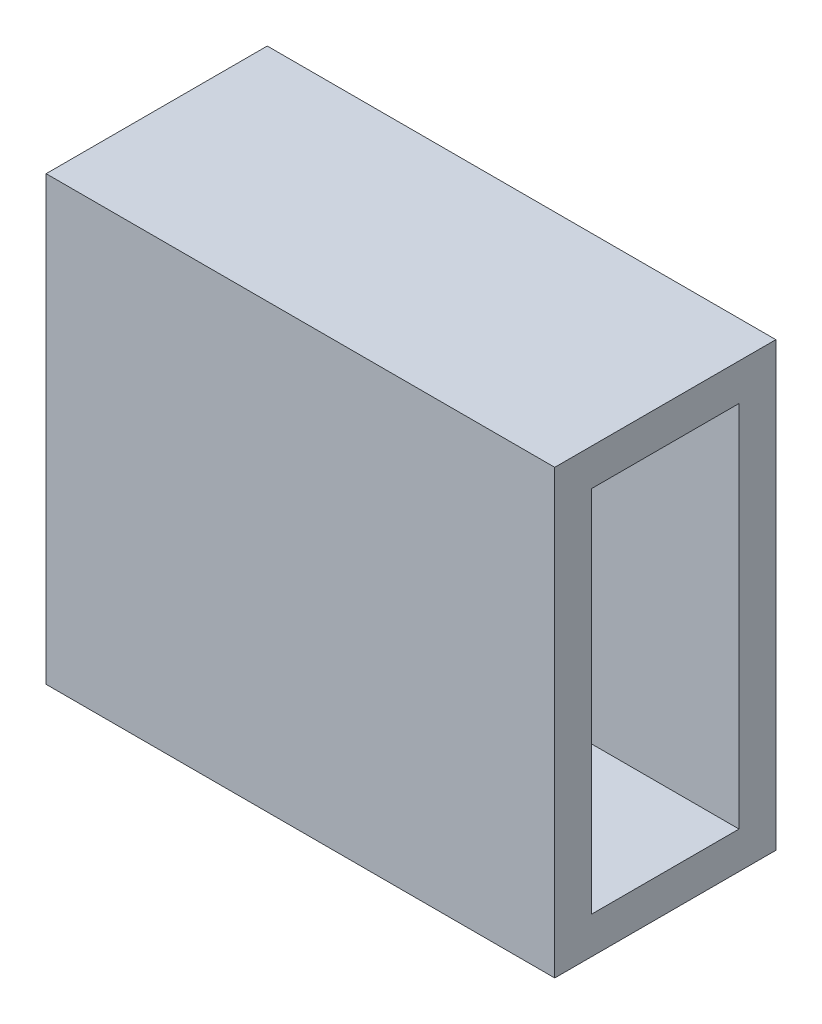
ISO-10303-21;
HEADER;
FILE_DESCRIPTION(('STEP AP214'),'2;1');
FILE_NAME('part.step','',(''),(''),'','','');
FILE_SCHEMA(('AUTOMOTIVE_DESIGN { 1 0 10303 214 1 1 1 1 }'));
ENDSEC;
DATA;
#1=APPLICATION_CONTEXT('core data for automotive mechanical design processes');
#2=APPLICATION_PROTOCOL_DEFINITION('international standard','automotive_design',2000,#1);
#3=PRODUCT_CONTEXT('',#1,'mechanical');
#4=PRODUCT('Part','Part','',(#3));
#5=PRODUCT_RELATED_PRODUCT_CATEGORY('part','',(#4));
#6=PRODUCT_DEFINITION_FORMATION('','',#4);
#7=PRODUCT_DEFINITION_CONTEXT('part definition',#1,'design');
#8=PRODUCT_DEFINITION('design','',#6,#7);
#9=PRODUCT_DEFINITION_SHAPE('','',#8);
#10=(LENGTH_UNIT() NAMED_UNIT(*) SI_UNIT(.MILLI.,.METRE.));
#11=(NAMED_UNIT(*) PLANE_ANGLE_UNIT() SI_UNIT($,.RADIAN.));
#12=(NAMED_UNIT(*) SI_UNIT($,.STERADIAN.) SOLID_ANGLE_UNIT());
#13=UNCERTAINTY_MEASURE_WITH_UNIT(LENGTH_MEASURE(1.E-05),#10,'distance_accuracy_value','');
#14=(GEOMETRIC_REPRESENTATION_CONTEXT(3) GLOBAL_UNCERTAINTY_ASSIGNED_CONTEXT((#13)) GLOBAL_UNIT_ASSIGNED_CONTEXT((#10,
#11,#12)) REPRESENTATION_CONTEXT('',''));
#15=CARTESIAN_POINT('',(0.,0.,0.));
#16=DIRECTION('',(0.,0.,1.));
#17=DIRECTION('',(1.,0.,0.));
#18=AXIS2_PLACEMENT_3D('',#15,#16,#17);
#19=CARTESIAN_POINT('',(21.694189942742,38.1,25.4));
#20=DIRECTION('',(0.,1.,0.));
#21=DIRECTION('',(0.,0.,1.));
#22=AXIS2_PLACEMENT_3D('',#19,#20,#21);
#23=PLANE('',#22);
#24=DIRECTION('',(-1.,0.,0.));
#25=VECTOR('',#24,1.);
#26=CARTESIAN_POINT('',(21.694189942742,38.1,25.4));
#27=LINE('',#26,#25);
#28=CARTESIAN_POINT('',(-64.77,38.1,25.4));
#29=VERTEX_POINT('',#28);
#30=CARTESIAN_POINT('',(-152.4,38.1,25.4));
#31=VERTEX_POINT('',#30);
#32=EDGE_CURVE('E127',#29,#31,#27,.T.);
#33=ORIENTED_EDGE('',*,*,#32,.F.);
#34=DIRECTION('',(0.,0.,-1.));
#35=VECTOR('',#34,1.);
#36=CARTESIAN_POINT('',(-64.77,38.1,25.4));
#37=LINE('',#36,#35);
#38=CARTESIAN_POINT('',(-64.77,38.1,-12.7));
#39=VERTEX_POINT('',#38);
#40=EDGE_CURVE('E121',#29,#39,#37,.T.);
#41=ORIENTED_EDGE('',*,*,#40,.T.);
#42=DIRECTION('',(-1.,0.,0.));
#43=VECTOR('',#42,1.);
#44=CARTESIAN_POINT('',(21.694189942742,38.1,-12.7));
#45=LINE('',#44,#43);
#46=CARTESIAN_POINT('',(-152.4,38.1,-12.7));
#47=VERTEX_POINT('',#46);
#48=EDGE_CURVE('E123',#39,#47,#45,.T.);
#49=ORIENTED_EDGE('',*,*,#48,.T.);
#50=DIRECTION('',(0.,0.,-1.));
#51=VECTOR('',#50,1.);
#52=CARTESIAN_POINT('',(-152.4,38.1,25.4));
#53=LINE('',#52,#51);
#54=EDGE_CURVE('E149',#31,#47,#53,.T.);
#55=ORIENTED_EDGE('',*,*,#54,.F.);
#56=EDGE_LOOP('',(#33,#41,#49,#55));
#57=FACE_BOUND('',#56,.T.);
#58=ADVANCED_FACE('F33',(#57),#23,.T.);
#59=CARTESIAN_POINT('',(21.694189942742,-38.1,25.4));
#60=DIRECTION('',(0.,0.,1.));
#61=DIRECTION('',(1.,0.,0.));
#62=AXIS2_PLACEMENT_3D('',#59,#60,#61);
#63=PLANE('',#62);
#64=DIRECTION('',(-1.,0.,0.));
#65=VECTOR('',#64,1.);
#66=CARTESIAN_POINT('',(21.694189942742,-38.1,25.4));
#67=LINE('',#66,#65);
#68=CARTESIAN_POINT('',(-64.77,-38.1,25.4));
#69=VERTEX_POINT('',#68);
#70=CARTESIAN_POINT('',(-152.4,-38.1,25.4));
#71=VERTEX_POINT('',#70);
#72=EDGE_CURVE('E130',#69,#71,#67,.T.);
#73=ORIENTED_EDGE('',*,*,#72,.F.);
#74=DIRECTION('',(0.,1.,0.));
#75=VECTOR('',#74,1.);
#76=CARTESIAN_POINT('',(-64.77,-38.1,25.4));
#77=LINE('',#76,#75);
#78=EDGE_CURVE('E124',#69,#29,#77,.T.);
#79=ORIENTED_EDGE('',*,*,#78,.T.);
#80=ORIENTED_EDGE('',*,*,#32,.T.);
#81=DIRECTION('',(0.,1.,0.));
#82=VECTOR('',#81,1.);
#83=CARTESIAN_POINT('',(-152.4,-38.1,25.4));
#84=LINE('',#83,#82);
#85=EDGE_CURVE('E116',#71,#31,#84,.T.);
#86=ORIENTED_EDGE('',*,*,#85,.F.);
#87=EDGE_LOOP('',(#73,#79,#80,#86));
#88=FACE_BOUND('',#87,.T.);
#89=ADVANCED_FACE('F169',(#88),#63,.T.);
#90=CARTESIAN_POINT('',(21.694189942742,-38.1,-12.7));
#91=DIRECTION('',(0.,-1.,0.));
#92=DIRECTION('',(0.,0.,-1.));
#93=AXIS2_PLACEMENT_3D('',#90,#91,#92);
#94=PLANE('',#93);
#95=DIRECTION('',(-1.,0.,0.));
#96=VECTOR('',#95,1.);
#97=CARTESIAN_POINT('',(21.694189942742,-38.1,-12.7));
#98=LINE('',#97,#96);
#99=CARTESIAN_POINT('',(-64.77,-38.1,-12.7));
#100=VERTEX_POINT('',#99);
#101=CARTESIAN_POINT('',(-152.4,-38.1,-12.7));
#102=VERTEX_POINT('',#101);
#103=EDGE_CURVE('E134',#100,#102,#98,.T.);
#104=ORIENTED_EDGE('',*,*,#103,.F.);
#105=DIRECTION('',(0.,0.,1.));
#106=VECTOR('',#105,1.);
#107=CARTESIAN_POINT('',(-64.77,-38.1,-12.7));
#108=LINE('',#107,#106);
#109=EDGE_CURVE('E128',#100,#69,#108,.T.);
#110=ORIENTED_EDGE('',*,*,#109,.T.);
#111=ORIENTED_EDGE('',*,*,#72,.T.);
#112=DIRECTION('',(0.,0.,1.));
#113=VECTOR('',#112,1.);
#114=CARTESIAN_POINT('',(-152.4,-38.1,-12.7));
#115=LINE('',#114,#113);
#116=EDGE_CURVE('E159',#102,#71,#115,.T.);
#117=ORIENTED_EDGE('',*,*,#116,.F.);
#118=EDGE_LOOP('',(#104,#110,#111,#117));
#119=FACE_BOUND('',#118,.T.);
#120=ADVANCED_FACE('F177',(#119),#94,.T.);
#121=CARTESIAN_POINT('',(21.694189942742,38.1,-12.7));
#122=DIRECTION('',(0.,0.,-1.));
#123=DIRECTION('',(-1.,0.,0.));
#124=AXIS2_PLACEMENT_3D('',#121,#122,#123);
#125=PLANE('',#124);
#126=ORIENTED_EDGE('',*,*,#48,.F.);
#127=DIRECTION('',(0.,-1.,0.));
#128=VECTOR('',#127,1.);
#129=CARTESIAN_POINT('',(-64.77,38.1,-12.7));
#130=LINE('',#129,#128);
#131=EDGE_CURVE('E51',#39,#100,#130,.T.);
#132=ORIENTED_EDGE('',*,*,#131,.T.);
#133=ORIENTED_EDGE('',*,*,#103,.T.);
#134=DIRECTION('',(0.,-1.,0.));
#135=VECTOR('',#134,1.);
#136=CARTESIAN_POINT('',(-152.4,38.1,-12.7));
#137=LINE('',#136,#135);
#138=EDGE_CURVE('E154',#47,#102,#137,.T.);
#139=ORIENTED_EDGE('',*,*,#138,.F.);
#140=EDGE_LOOP('',(#126,#132,#133,#139));
#141=FACE_BOUND('',#140,.T.);
#142=ADVANCED_FACE('F174',(#141),#125,.T.);
#143=CARTESIAN_POINT('',(21.694189942742,-31.75,19.05));
#144=DIRECTION('',(0.,0.,1.));
#145=DIRECTION('',(1.,0.,0.));
#146=AXIS2_PLACEMENT_3D('',#143,#144,#145);
#147=PLANE('',#146);
#148=DIRECTION('',(0.,1.,0.));
#149=VECTOR('',#148,1.);
#150=CARTESIAN_POINT('',(-64.77,-31.75,19.05));
#151=LINE('',#150,#149);
#152=CARTESIAN_POINT('',(-64.77,-31.75,19.05));
#153=VERTEX_POINT('',#152);
#154=CARTESIAN_POINT('',(-64.77,31.75,19.05));
#155=VERTEX_POINT('',#154);
#156=EDGE_CURVE('E97',#153,#155,#151,.T.);
#157=ORIENTED_EDGE('',*,*,#156,.F.);
#158=DIRECTION('',(-1.,0.,0.));
#159=VECTOR('',#158,1.);
#160=CARTESIAN_POINT('',(21.694189942742,-31.75,19.05));
#161=LINE('',#160,#159);
#162=CARTESIAN_POINT('',(-152.4,-31.75,19.05));
#163=VERTEX_POINT('',#162);
#164=EDGE_CURVE('E136',#153,#163,#161,.T.);
#165=ORIENTED_EDGE('',*,*,#164,.T.);
#166=DIRECTION('',(0.,1.,0.));
#167=VECTOR('',#166,1.);
#168=CARTESIAN_POINT('',(-152.4,-31.75,19.05));
#169=LINE('',#168,#167);
#170=CARTESIAN_POINT('',(-152.4,31.75,19.05));
#171=VERTEX_POINT('',#170);
#172=EDGE_CURVE('E100',#163,#171,#169,.T.);
#173=ORIENTED_EDGE('',*,*,#172,.T.);
#174=DIRECTION('',(-1.,0.,0.));
#175=VECTOR('',#174,1.);
#176=CARTESIAN_POINT('',(21.694189942742,31.75,19.05));
#177=LINE('',#176,#175);
#178=EDGE_CURVE('E37',#155,#171,#177,.T.);
#179=ORIENTED_EDGE('',*,*,#178,.F.);
#180=EDGE_LOOP('',(#157,#165,#173,#179));
#181=FACE_BOUND('',#180,.T.);
#182=ADVANCED_FACE('F95',(#181),#147,.F.);
#183=CARTESIAN_POINT('',(21.694189942742,-31.75,-6.35));
#184=DIRECTION('',(0.,-1.,0.));
#185=DIRECTION('',(0.,0.,-1.));
#186=AXIS2_PLACEMENT_3D('',#183,#184,#185);
#187=PLANE('',#186);
#188=DIRECTION('',(0.,0.,1.));
#189=VECTOR('',#188,1.);
#190=CARTESIAN_POINT('',(-64.77,-31.75,-6.35));
#191=LINE('',#190,#189);
#192=CARTESIAN_POINT('',(-64.77,-31.75,-6.35));
#193=VERTEX_POINT('',#192);
#194=EDGE_CURVE('E114',#193,#153,#191,.T.);
#195=ORIENTED_EDGE('',*,*,#194,.F.);
#196=DIRECTION('',(-1.,0.,0.));
#197=VECTOR('',#196,1.);
#198=CARTESIAN_POINT('',(21.694189942742,-31.75,-6.35));
#199=LINE('',#198,#197);
#200=CARTESIAN_POINT('',(-152.4,-31.75,-6.35));
#201=VERTEX_POINT('',#200);
#202=EDGE_CURVE('E139',#193,#201,#199,.T.);
#203=ORIENTED_EDGE('',*,*,#202,.T.);
#204=DIRECTION('',(0.,0.,1.));
#205=VECTOR('',#204,1.);
#206=CARTESIAN_POINT('',(-152.4,-31.75,-6.35));
#207=LINE('',#206,#205);
#208=EDGE_CURVE('E140',#201,#163,#207,.T.);
#209=ORIENTED_EDGE('',*,*,#208,.T.);
#210=ORIENTED_EDGE('',*,*,#164,.F.);
#211=EDGE_LOOP('',(#195,#203,#209,#210));
#212=FACE_BOUND('',#211,.T.);
#213=ADVANCED_FACE('F197',(#212),#187,.F.);
#214=CARTESIAN_POINT('',(21.694189942742,31.75,-6.35));
#215=DIRECTION('',(0.,0.,-1.));
#216=DIRECTION('',(-1.,0.,0.));
#217=AXIS2_PLACEMENT_3D('',#214,#215,#216);
#218=PLANE('',#217);
#219=DIRECTION('',(0.,-1.,0.));
#220=VECTOR('',#219,1.);
#221=CARTESIAN_POINT('',(-64.77,31.75,-6.35));
#222=LINE('',#221,#220);
#223=CARTESIAN_POINT('',(-64.77,31.75,-6.34999999999999));
#224=VERTEX_POINT('',#223);
#225=EDGE_CURVE('E12',#224,#193,#222,.T.);
#226=ORIENTED_EDGE('',*,*,#225,.F.);
#227=DIRECTION('',(-1.,0.,0.));
#228=VECTOR('',#227,1.);
#229=CARTESIAN_POINT('',(21.694189942742,31.75,-6.35));
#230=LINE('',#229,#228);
#231=CARTESIAN_POINT('',(-152.4,31.75,-6.35));
#232=VERTEX_POINT('',#231);
#233=EDGE_CURVE('E109',#224,#232,#230,.T.);
#234=ORIENTED_EDGE('',*,*,#233,.T.);
#235=DIRECTION('',(0.,-1.,0.));
#236=VECTOR('',#235,1.);
#237=CARTESIAN_POINT('',(-152.4,31.75,-6.35));
#238=LINE('',#237,#236);
#239=EDGE_CURVE('E105',#232,#201,#238,.T.);
#240=ORIENTED_EDGE('',*,*,#239,.T.);
#241=ORIENTED_EDGE('',*,*,#202,.F.);
#242=EDGE_LOOP('',(#226,#234,#240,#241));
#243=FACE_BOUND('',#242,.T.);
#244=ADVANCED_FACE('F194',(#243),#218,.F.);
#245=CARTESIAN_POINT('',(21.694189942742,31.75,19.05));
#246=DIRECTION('',(0.,1.,0.));
#247=DIRECTION('',(0.,0.,1.));
#248=AXIS2_PLACEMENT_3D('',#245,#246,#247);
#249=PLANE('',#248);
#250=DIRECTION('',(0.,0.,-1.));
#251=VECTOR('',#250,1.);
#252=CARTESIAN_POINT('',(-64.77,31.75,19.05));
#253=LINE('',#252,#251);
#254=EDGE_CURVE('E43',#155,#224,#253,.T.);
#255=ORIENTED_EDGE('',*,*,#254,.F.);
#256=ORIENTED_EDGE('',*,*,#178,.T.);
#257=DIRECTION('',(0.,0.,-1.));
#258=VECTOR('',#257,1.);
#259=CARTESIAN_POINT('',(-152.4,31.75,19.05));
#260=LINE('',#259,#258);
#261=EDGE_CURVE('E104',#171,#232,#260,.T.);
#262=ORIENTED_EDGE('',*,*,#261,.T.);
#263=ORIENTED_EDGE('',*,*,#233,.F.);
#264=EDGE_LOOP('',(#255,#256,#262,#263));
#265=FACE_BOUND('',#264,.T.);
#266=ADVANCED_FACE('F108',(#265),#249,.F.);
#267=CARTESIAN_POINT('',(-152.4,0.,0.));
#268=DIRECTION('',(-1.,0.,0.));
#269=DIRECTION('',(0.,0.,1.));
#270=AXIS2_PLACEMENT_3D('',#267,#268,#269);
#271=PLANE('',#270);
#272=ORIENTED_EDGE('',*,*,#172,.F.);
#273=ORIENTED_EDGE('',*,*,#208,.F.);
#274=ORIENTED_EDGE('',*,*,#239,.F.);
#275=ORIENTED_EDGE('',*,*,#261,.F.);
#276=EDGE_LOOP('',(#272,#273,#274,#275));
#277=FACE_BOUND('',#276,.T.);
#278=ORIENTED_EDGE('',*,*,#54,.T.);
#279=ORIENTED_EDGE('',*,*,#138,.T.);
#280=ORIENTED_EDGE('',*,*,#116,.T.);
#281=ORIENTED_EDGE('',*,*,#85,.T.);
#282=EDGE_LOOP('',(#278,#279,#280,#281));
#283=FACE_BOUND('',#282,.T.);
#284=ADVANCED_FACE('F165',(#277,#283),#271,.T.);
#285=CARTESIAN_POINT('',(-64.77,38.1,-12.7));
#286=DIRECTION('',(1.,0.,0.));
#287=DIRECTION('',(0.,0.,-1.));
#288=AXIS2_PLACEMENT_3D('',#285,#286,#287);
#289=PLANE('',#288);
#290=ORIENTED_EDGE('',*,*,#40,.F.);
#291=ORIENTED_EDGE('',*,*,#78,.F.);
#292=ORIENTED_EDGE('',*,*,#109,.F.);
#293=ORIENTED_EDGE('',*,*,#131,.F.);
#294=EDGE_LOOP('',(#290,#291,#292,#293));
#295=FACE_BOUND('',#294,.T.);
#296=ORIENTED_EDGE('',*,*,#194,.T.);
#297=ORIENTED_EDGE('',*,*,#156,.T.);
#298=ORIENTED_EDGE('',*,*,#254,.T.);
#299=ORIENTED_EDGE('',*,*,#225,.T.);
#300=EDGE_LOOP('',(#296,#297,#298,#299));
#301=FACE_BOUND('',#300,.T.);
#302=ADVANCED_FACE('F35',(#295,#301),#289,.T.);
#303=CLOSED_SHELL('',(#58,#89,#120,#142,#182,#213,#244,#266,#284,#302));
#304=MANIFOLD_SOLID_BREP('B2',#303);
#305=ADVANCED_BREP_SHAPE_REPRESENTATION('',(#18,#304),#14);
#306=SHAPE_DEFINITION_REPRESENTATION(#9,#305);
ENDSEC;
END-ISO-10303-21;
